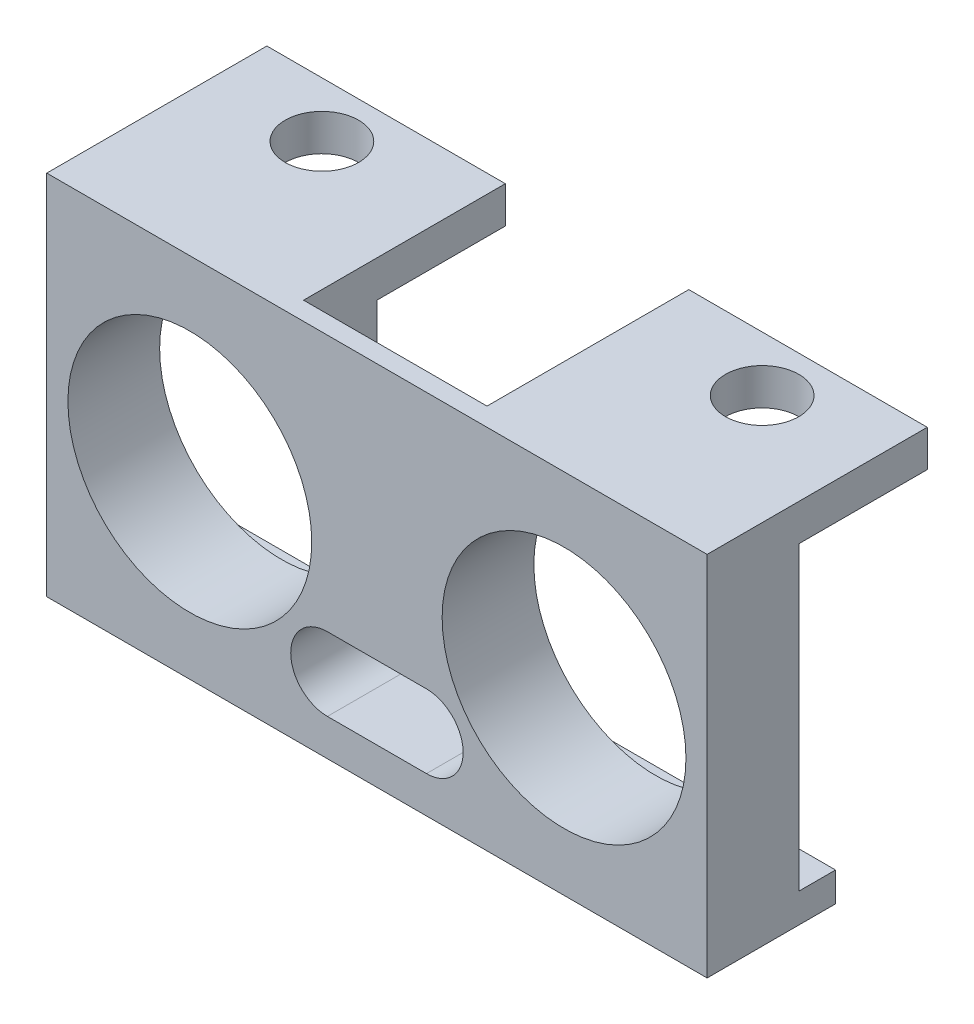
ISO-10303-21;
HEADER;
FILE_DESCRIPTION(('STEP AP214'),'2;1');
FILE_NAME('part.step','',(''),(''),'','','');
FILE_SCHEMA(('AUTOMOTIVE_DESIGN { 1 0 10303 214 1 1 1 1 }'));
ENDSEC;
DATA;
#1=APPLICATION_CONTEXT('core data for automotive mechanical design processes');
#2=APPLICATION_PROTOCOL_DEFINITION('international standard','automotive_design',2000,#1);
#3=PRODUCT_CONTEXT('',#1,'mechanical');
#4=PRODUCT('Part','Part','',(#3));
#5=PRODUCT_RELATED_PRODUCT_CATEGORY('part','',(#4));
#6=PRODUCT_DEFINITION_FORMATION('','',#4);
#7=PRODUCT_DEFINITION_CONTEXT('part definition',#1,'design');
#8=PRODUCT_DEFINITION('design','',#6,#7);
#9=PRODUCT_DEFINITION_SHAPE('','',#8);
#10=(LENGTH_UNIT() NAMED_UNIT(*) SI_UNIT(.MILLI.,.METRE.));
#11=(NAMED_UNIT(*) PLANE_ANGLE_UNIT() SI_UNIT($,.RADIAN.));
#12=(NAMED_UNIT(*) SI_UNIT($,.STERADIAN.) SOLID_ANGLE_UNIT());
#13=UNCERTAINTY_MEASURE_WITH_UNIT(LENGTH_MEASURE(1.E-05),#10,'distance_accuracy_value','');
#14=(GEOMETRIC_REPRESENTATION_CONTEXT(3) GLOBAL_UNCERTAINTY_ASSIGNED_CONTEXT((#13)) GLOBAL_UNIT_ASSIGNED_CONTEXT((#10,
#11,#12)) REPRESENTATION_CONTEXT('',''));
#15=CARTESIAN_POINT('',(0.,0.,0.));
#16=DIRECTION('',(0.,0.,1.));
#17=DIRECTION('',(1.,0.,0.));
#18=AXIS2_PLACEMENT_3D('',#15,#16,#17);
#19=CARTESIAN_POINT('',(0.,0.,0.));
#20=DIRECTION('',(0.,0.,-1.));
#21=DIRECTION('',(-1.,0.,0.));
#22=AXIS2_PLACEMENT_3D('',#19,#20,#21);
#23=PLANE('',#22);
#24=CARTESIAN_POINT('',(9.906,12.446,0.));
#25=DIRECTION('',(0.,0.,1.));
#26=DIRECTION('',(1.,0.,0.));
#27=AXIS2_PLACEMENT_3D('',#24,#25,#26);
#28=CIRCLE('',#27,8.44);
#29=CARTESIAN_POINT('',(18.346,12.446,0.));
#30=VERTEX_POINT('',#29);
#31=EDGE_CURVE('E296',#30,#30,#28,.T.);
#32=ORIENTED_EDGE('',*,*,#31,.T.);
#33=EDGE_LOOP('',(#32));
#34=FACE_BOUND('',#33,.T.);
#35=CARTESIAN_POINT('',(35.814,12.446,0.));
#36=DIRECTION('',(0.,0.,1.));
#37=DIRECTION('',(1.,0.,0.));
#38=AXIS2_PLACEMENT_3D('',#35,#36,#37);
#39=CIRCLE('',#38,8.44);
#40=CARTESIAN_POINT('',(44.254,12.446,0.));
#41=VERTEX_POINT('',#40);
#42=EDGE_CURVE('E292',#41,#41,#39,.T.);
#43=ORIENTED_EDGE('',*,*,#42,.T.);
#44=EDGE_LOOP('',(#43));
#45=FACE_BOUND('',#44,.T.);
#46=DIRECTION('',(-1.,0.,0.));
#47=VECTOR('',#46,1.);
#48=CARTESIAN_POINT('',(19.431,7.62,0.));
#49=LINE('',#48,#47);
#50=CARTESIAN_POINT('',(26.289,7.62,0.));
#51=VERTEX_POINT('',#50);
#52=CARTESIAN_POINT('',(19.431,7.62,0.));
#53=VERTEX_POINT('',#52);
#54=EDGE_CURVE('E267',#51,#53,#49,.T.);
#55=ORIENTED_EDGE('',*,*,#54,.T.);
#56=CARTESIAN_POINT('',(19.431,5.08,0.));
#57=DIRECTION('',(0.,0.,1.));
#58=DIRECTION('',(1.,0.,0.));
#59=AXIS2_PLACEMENT_3D('',#56,#57,#58);
#60=CIRCLE('',#59,2.54);
#61=CARTESIAN_POINT('',(19.431,2.54,0.));
#62=VERTEX_POINT('',#61);
#63=EDGE_CURVE('E262',#53,#62,#60,.T.);
#64=ORIENTED_EDGE('',*,*,#63,.T.);
#65=DIRECTION('',(1.,0.,0.));
#66=VECTOR('',#65,1.);
#67=CARTESIAN_POINT('',(19.431,2.54,0.));
#68=LINE('',#67,#66);
#69=CARTESIAN_POINT('',(26.289,2.54,0.));
#70=VERTEX_POINT('',#69);
#71=EDGE_CURVE('E276',#62,#70,#68,.T.);
#72=ORIENTED_EDGE('',*,*,#71,.T.);
#73=CARTESIAN_POINT('',(26.289,5.08,0.));
#74=DIRECTION('',(0.,0.,1.));
#75=DIRECTION('',(1.,0.,0.));
#76=AXIS2_PLACEMENT_3D('',#73,#74,#75);
#77=CIRCLE('',#76,2.54);
#78=EDGE_CURVE('E279',#70,#51,#77,.T.);
#79=ORIENTED_EDGE('',*,*,#78,.T.);
#80=EDGE_LOOP('',(#55,#64,#72,#79));
#81=FACE_BOUND('',#80,.T.);
#82=DIRECTION('',(0.,1.,0.));
#83=VECTOR('',#82,1.);
#84=CARTESIAN_POINT('',(45.72,0.,0.));
#85=LINE('',#84,#83);
#86=CARTESIAN_POINT('',(45.72,2.032,0.));
#87=VERTEX_POINT('',#86);
#88=CARTESIAN_POINT('',(45.72,22.86,0.));
#89=VERTEX_POINT('',#88);
#90=EDGE_CURVE('E314',#87,#89,#85,.T.);
#91=ORIENTED_EDGE('',*,*,#90,.F.);
#92=DIRECTION('',(1.,0.,0.));
#93=VECTOR('',#92,1.);
#94=CARTESIAN_POINT('',(45.72,2.032,0.));
#95=LINE('',#94,#93);
#96=CARTESIAN_POINT('',(0.,2.032,0.));
#97=VERTEX_POINT('',#96);
#98=EDGE_CURVE('E181',#97,#87,#95,.T.);
#99=ORIENTED_EDGE('',*,*,#98,.F.);
#100=DIRECTION('',(0.,-1.,0.));
#101=VECTOR('',#100,1.);
#102=CARTESIAN_POINT('',(0.,0.,0.));
#103=LINE('',#102,#101);
#104=CARTESIAN_POINT('',(0.,22.86,0.));
#105=VERTEX_POINT('',#104);
#106=EDGE_CURVE('E302',#105,#97,#103,.T.);
#107=ORIENTED_EDGE('',*,*,#106,.F.);
#108=DIRECTION('',(-1.,0.,0.));
#109=VECTOR('',#108,1.);
#110=CARTESIAN_POINT('',(0.,22.86,0.));
#111=LINE('',#110,#109);
#112=CARTESIAN_POINT('',(16.51,22.86,0.));
#113=VERTEX_POINT('',#112);
#114=EDGE_CURVE('E316',#113,#105,#111,.T.);
#115=ORIENTED_EDGE('',*,*,#114,.F.);
#116=DIRECTION('',(0.,1.,0.));
#117=VECTOR('',#116,1.);
#118=CARTESIAN_POINT('',(16.51,22.86,0.));
#119=LINE('',#118,#117);
#120=CARTESIAN_POINT('',(16.51,19.05,0.));
#121=VERTEX_POINT('',#120);
#122=EDGE_CURVE('E248',#121,#113,#119,.T.);
#123=ORIENTED_EDGE('',*,*,#122,.F.);
#124=DIRECTION('',(-1.,0.,0.));
#125=VECTOR('',#124,1.);
#126=CARTESIAN_POINT('',(29.21,19.05,0.));
#127=LINE('',#126,#125);
#128=CARTESIAN_POINT('',(29.21,19.05,0.));
#129=VERTEX_POINT('',#128);
#130=EDGE_CURVE('E256',#129,#121,#127,.T.);
#131=ORIENTED_EDGE('',*,*,#130,.F.);
#132=DIRECTION('',(0.,-1.,0.));
#133=VECTOR('',#132,1.);
#134=CARTESIAN_POINT('',(29.21,22.86,0.));
#135=LINE('',#134,#133);
#136=CARTESIAN_POINT('',(29.21,22.86,0.));
#137=VERTEX_POINT('',#136);
#138=EDGE_CURVE('E236',#137,#129,#135,.T.);
#139=ORIENTED_EDGE('',*,*,#138,.F.);
#140=EDGE_CURVE('E309',#89,#137,#111,.T.);
#141=ORIENTED_EDGE('',*,*,#140,.F.);
#142=EDGE_LOOP('',(#91,#99,#107,#115,#123,#131,#139,#141));
#143=FACE_BOUND('',#142,.T.);
#144=ADVANCED_FACE('F39',(#34,#45,#81,#143),#23,.T.);
#145=CARTESIAN_POINT('',(0.,0.,6.35));
#146=DIRECTION('',(0.,0.,-1.));
#147=DIRECTION('',(-1.,0.,0.));
#148=AXIS2_PLACEMENT_3D('',#145,#146,#147);
#149=PLANE('',#148);
#150=CARTESIAN_POINT('',(35.814,12.446,6.35));
#151=DIRECTION('',(0.,0.,1.));
#152=DIRECTION('',(1.,0.,0.));
#153=AXIS2_PLACEMENT_3D('',#150,#151,#152);
#154=CIRCLE('',#153,8.44);
#155=CARTESIAN_POINT('',(44.254,12.446,6.35));
#156=VERTEX_POINT('',#155);
#157=EDGE_CURVE('E293',#156,#156,#154,.T.);
#158=ORIENTED_EDGE('',*,*,#157,.F.);
#159=EDGE_LOOP('',(#158));
#160=FACE_BOUND('',#159,.T.);
#161=CARTESIAN_POINT('',(9.906,12.446,6.35));
#162=DIRECTION('',(0.,0.,1.));
#163=DIRECTION('',(1.,0.,0.));
#164=AXIS2_PLACEMENT_3D('',#161,#162,#163);
#165=CIRCLE('',#164,8.44);
#166=CARTESIAN_POINT('',(18.346,12.446,6.35));
#167=VERTEX_POINT('',#166);
#168=EDGE_CURVE('E299',#167,#167,#165,.T.);
#169=ORIENTED_EDGE('',*,*,#168,.F.);
#170=EDGE_LOOP('',(#169));
#171=FACE_BOUND('',#170,.T.);
#172=DIRECTION('',(0.,-1.,0.));
#173=VECTOR('',#172,1.);
#174=CARTESIAN_POINT('',(0.,0.,6.35));
#175=LINE('',#174,#173);
#176=CARTESIAN_POINT('',(0.,25.4,6.35));
#177=VERTEX_POINT('',#176);
#178=CARTESIAN_POINT('',(0.,0.,6.35));
#179=VERTEX_POINT('',#178);
#180=EDGE_CURVE('E305',#177,#179,#175,.T.);
#181=ORIENTED_EDGE('',*,*,#180,.T.);
#182=DIRECTION('',(1.,0.,0.));
#183=VECTOR('',#182,1.);
#184=CARTESIAN_POINT('',(0.,0.,6.35));
#185=LINE('',#184,#183);
#186=CARTESIAN_POINT('',(45.72,0.,6.35));
#187=VERTEX_POINT('',#186);
#188=EDGE_CURVE('E308',#179,#187,#185,.T.);
#189=ORIENTED_EDGE('',*,*,#188,.T.);
#190=DIRECTION('',(0.,1.,0.));
#191=VECTOR('',#190,1.);
#192=CARTESIAN_POINT('',(45.72,0.,6.35));
#193=LINE('',#192,#191);
#194=CARTESIAN_POINT('',(45.72,25.4,6.35));
#195=VERTEX_POINT('',#194);
#196=EDGE_CURVE('E168',#187,#195,#193,.T.);
#197=ORIENTED_EDGE('',*,*,#196,.T.);
#198=DIRECTION('',(-1.,0.,0.));
#199=VECTOR('',#198,1.);
#200=CARTESIAN_POINT('',(45.72,25.4,6.35));
#201=LINE('',#200,#199);
#202=EDGE_CURVE('E216',#195,#177,#201,.T.);
#203=ORIENTED_EDGE('',*,*,#202,.T.);
#204=EDGE_LOOP('',(#181,#189,#197,#203));
#205=FACE_BOUND('',#204,.T.);
#206=CARTESIAN_POINT('',(19.431,5.08,6.35));
#207=DIRECTION('',(0.,0.,1.));
#208=DIRECTION('',(1.,0.,0.));
#209=AXIS2_PLACEMENT_3D('',#206,#207,#208);
#210=CIRCLE('',#209,2.54);
#211=CARTESIAN_POINT('',(19.431,7.62,6.35));
#212=VERTEX_POINT('',#211);
#213=CARTESIAN_POINT('',(19.431,2.54,6.35));
#214=VERTEX_POINT('',#213);
#215=EDGE_CURVE('E264',#212,#214,#210,.T.);
#216=ORIENTED_EDGE('',*,*,#215,.F.);
#217=DIRECTION('',(-1.,0.,0.));
#218=VECTOR('',#217,1.);
#219=CARTESIAN_POINT('',(19.431,7.62,6.35));
#220=LINE('',#219,#218);
#221=CARTESIAN_POINT('',(26.289,7.62,6.35));
#222=VERTEX_POINT('',#221);
#223=EDGE_CURVE('E271',#222,#212,#220,.T.);
#224=ORIENTED_EDGE('',*,*,#223,.F.);
#225=CARTESIAN_POINT('',(26.289,5.08,6.35));
#226=DIRECTION('',(0.,0.,1.));
#227=DIRECTION('',(1.,0.,0.));
#228=AXIS2_PLACEMENT_3D('',#225,#226,#227);
#229=CIRCLE('',#228,2.54);
#230=CARTESIAN_POINT('',(26.289,2.54,6.35));
#231=VERTEX_POINT('',#230);
#232=EDGE_CURVE('E269',#231,#222,#229,.T.);
#233=ORIENTED_EDGE('',*,*,#232,.F.);
#234=DIRECTION('',(1.,0.,0.));
#235=VECTOR('',#234,1.);
#236=CARTESIAN_POINT('',(19.431,2.54,6.35));
#237=LINE('',#236,#235);
#238=EDGE_CURVE('E266',#214,#231,#237,.T.);
#239=ORIENTED_EDGE('',*,*,#238,.F.);
#240=EDGE_LOOP('',(#216,#224,#233,#239));
#241=FACE_BOUND('',#240,.T.);
#242=ADVANCED_FACE('F361',(#160,#171,#205,#241),#149,.F.);
#243=CARTESIAN_POINT('',(0.,0.,6.35));
#244=DIRECTION('',(1.,0.,0.));
#245=DIRECTION('',(0.,0.,-1.));
#246=AXIS2_PLACEMENT_3D('',#243,#244,#245);
#247=PLANE('',#246);
#248=ORIENTED_EDGE('',*,*,#106,.T.);
#249=DIRECTION('',(0.,0.,1.));
#250=VECTOR('',#249,1.);
#251=CARTESIAN_POINT('',(0.,2.032,-2.54));
#252=LINE('',#251,#250);
#253=CARTESIAN_POINT('',(0.,2.032,-2.54));
#254=VERTEX_POINT('',#253);
#255=EDGE_CURVE('E192',#254,#97,#252,.T.);
#256=ORIENTED_EDGE('',*,*,#255,.F.);
#257=DIRECTION('',(0.,1.,0.));
#258=VECTOR('',#257,1.);
#259=CARTESIAN_POINT('',(0.,0.,-2.54));
#260=LINE('',#259,#258);
#261=CARTESIAN_POINT('',(0.,0.,-2.54));
#262=VERTEX_POINT('',#261);
#263=EDGE_CURVE('E176',#262,#254,#260,.T.);
#264=ORIENTED_EDGE('',*,*,#263,.F.);
#265=DIRECTION('',(0.,0.,-1.));
#266=VECTOR('',#265,1.);
#267=CARTESIAN_POINT('',(0.,0.,6.35));
#268=LINE('',#267,#266);
#269=EDGE_CURVE('E11',#179,#262,#268,.T.);
#270=ORIENTED_EDGE('',*,*,#269,.F.);
#271=ORIENTED_EDGE('',*,*,#180,.F.);
#272=DIRECTION('',(0.,0.,-1.));
#273=VECTOR('',#272,1.);
#274=CARTESIAN_POINT('',(0.,25.4,6.35));
#275=LINE('',#274,#273);
#276=CARTESIAN_POINT('',(0.,25.4,-8.89));
#277=VERTEX_POINT('',#276);
#278=EDGE_CURVE('E195',#177,#277,#275,.T.);
#279=ORIENTED_EDGE('',*,*,#278,.T.);
#280=DIRECTION('',(0.,-1.,0.));
#281=VECTOR('',#280,1.);
#282=CARTESIAN_POINT('',(0.,25.4,-8.89));
#283=LINE('',#282,#281);
#284=CARTESIAN_POINT('',(0.,22.86,-8.89));
#285=VERTEX_POINT('',#284);
#286=EDGE_CURVE('E219',#277,#285,#283,.T.);
#287=ORIENTED_EDGE('',*,*,#286,.T.);
#288=DIRECTION('',(0.,0.,-1.));
#289=VECTOR('',#288,1.);
#290=CARTESIAN_POINT('',(0.,22.86,6.35));
#291=LINE('',#290,#289);
#292=EDGE_CURVE('E194',#105,#285,#291,.T.);
#293=ORIENTED_EDGE('',*,*,#292,.F.);
#294=EDGE_LOOP('',(#248,#256,#264,#270,#271,#279,#287,#293));
#295=FACE_BOUND('',#294,.T.);
#296=ADVANCED_FACE('F41',(#295),#247,.F.);
#297=CARTESIAN_POINT('',(0.,0.,6.35));
#298=DIRECTION('',(0.,1.,0.));
#299=DIRECTION('',(0.,0.,1.));
#300=AXIS2_PLACEMENT_3D('',#297,#298,#299);
#301=PLANE('',#300);
#302=ORIENTED_EDGE('',*,*,#269,.T.);
#303=DIRECTION('',(-1.,0.,0.));
#304=VECTOR('',#303,1.);
#305=CARTESIAN_POINT('',(45.72,0.,-2.54));
#306=LINE('',#305,#304);
#307=CARTESIAN_POINT('',(45.72,0.,-2.54));
#308=VERTEX_POINT('',#307);
#309=EDGE_CURVE('E171',#308,#262,#306,.T.);
#310=ORIENTED_EDGE('',*,*,#309,.F.);
#311=DIRECTION('',(0.,0.,-1.));
#312=VECTOR('',#311,1.);
#313=CARTESIAN_POINT('',(45.72,0.,6.35));
#314=LINE('',#313,#312);
#315=EDGE_CURVE('E47',#187,#308,#314,.T.);
#316=ORIENTED_EDGE('',*,*,#315,.F.);
#317=ORIENTED_EDGE('',*,*,#188,.F.);
#318=EDGE_LOOP('',(#302,#310,#316,#317));
#319=FACE_BOUND('',#318,.T.);
#320=ADVANCED_FACE('F172',(#319),#301,.F.);
#321=CARTESIAN_POINT('',(45.72,0.,6.35));
#322=DIRECTION('',(-1.,0.,0.));
#323=DIRECTION('',(0.,0.,1.));
#324=AXIS2_PLACEMENT_3D('',#321,#322,#323);
#325=PLANE('',#324);
#326=ORIENTED_EDGE('',*,*,#315,.T.);
#327=DIRECTION('',(0.,-1.,0.));
#328=VECTOR('',#327,1.);
#329=CARTESIAN_POINT('',(45.72,0.,-2.54));
#330=LINE('',#329,#328);
#331=CARTESIAN_POINT('',(45.72,2.032,-2.54));
#332=VERTEX_POINT('',#331);
#333=EDGE_CURVE('E166',#332,#308,#330,.T.);
#334=ORIENTED_EDGE('',*,*,#333,.F.);
#335=DIRECTION('',(0.,0.,1.));
#336=VECTOR('',#335,1.);
#337=CARTESIAN_POINT('',(45.72,2.032,-2.54));
#338=LINE('',#337,#336);
#339=EDGE_CURVE('E54',#332,#87,#338,.T.);
#340=ORIENTED_EDGE('',*,*,#339,.T.);
#341=ORIENTED_EDGE('',*,*,#90,.T.);
#342=DIRECTION('',(0.,0.,1.));
#343=VECTOR('',#342,1.);
#344=CARTESIAN_POINT('',(45.72,22.86,-8.89));
#345=LINE('',#344,#343);
#346=CARTESIAN_POINT('',(45.72,22.86,-8.89));
#347=VERTEX_POINT('',#346);
#348=EDGE_CURVE('E199',#347,#89,#345,.T.);
#349=ORIENTED_EDGE('',*,*,#348,.F.);
#350=DIRECTION('',(0.,-1.,0.));
#351=VECTOR('',#350,1.);
#352=CARTESIAN_POINT('',(45.72,25.4,-8.89));
#353=LINE('',#352,#351);
#354=CARTESIAN_POINT('',(45.72,25.4,-8.89));
#355=VERTEX_POINT('',#354);
#356=EDGE_CURVE('E234',#355,#347,#353,.T.);
#357=ORIENTED_EDGE('',*,*,#356,.F.);
#358=DIRECTION('',(0.,0.,1.));
#359=VECTOR('',#358,1.);
#360=CARTESIAN_POINT('',(45.72,25.4,-8.89));
#361=LINE('',#360,#359);
#362=EDGE_CURVE('E214',#355,#195,#361,.T.);
#363=ORIENTED_EDGE('',*,*,#362,.T.);
#364=ORIENTED_EDGE('',*,*,#196,.F.);
#365=EDGE_LOOP('',(#326,#334,#340,#341,#349,#357,#363,#364));
#366=FACE_BOUND('',#365,.T.);
#367=ADVANCED_FACE('F164',(#366),#325,.F.);
#368=CARTESIAN_POINT('',(9.906,12.446,6.35));
#369=DIRECTION('',(0.,0.,-1.));
#370=DIRECTION('',(-1.,0.,0.));
#371=AXIS2_PLACEMENT_3D('',#368,#369,#370);
#372=CYLINDRICAL_SURFACE('',#371,8.44);
#373=ORIENTED_EDGE('',*,*,#168,.T.);
#374=EDGE_LOOP('',(#373));
#375=FACE_BOUND('',#374,.T.);
#376=ORIENTED_EDGE('',*,*,#31,.F.);
#377=EDGE_LOOP('',(#376));
#378=FACE_BOUND('',#377,.T.);
#379=ADVANCED_FACE('F394',(#375,#378),#372,.F.);
#380=CARTESIAN_POINT('',(35.814,12.446,6.35));
#381=DIRECTION('',(0.,0.,-1.));
#382=DIRECTION('',(-1.,0.,0.));
#383=AXIS2_PLACEMENT_3D('',#380,#381,#382);
#384=CYLINDRICAL_SURFACE('',#383,8.44);
#385=ORIENTED_EDGE('',*,*,#157,.T.);
#386=EDGE_LOOP('',(#385));
#387=FACE_BOUND('',#386,.T.);
#388=ORIENTED_EDGE('',*,*,#42,.F.);
#389=EDGE_LOOP('',(#388));
#390=FACE_BOUND('',#389,.T.);
#391=ADVANCED_FACE('F551',(#387,#390),#384,.F.);
#392=CARTESIAN_POINT('',(19.431,5.08,6.35));
#393=DIRECTION('',(0.,0.,-1.));
#394=DIRECTION('',(-1.,0.,0.));
#395=AXIS2_PLACEMENT_3D('',#392,#393,#394);
#396=CYLINDRICAL_SURFACE('',#395,2.54);
#397=ORIENTED_EDGE('',*,*,#63,.F.);
#398=DIRECTION('',(0.,0.,-1.));
#399=VECTOR('',#398,1.);
#400=CARTESIAN_POINT('',(19.431,7.62,6.35));
#401=LINE('',#400,#399);
#402=EDGE_CURVE('E273',#212,#53,#401,.T.);
#403=ORIENTED_EDGE('',*,*,#402,.F.);
#404=ORIENTED_EDGE('',*,*,#215,.T.);
#405=DIRECTION('',(0.,0.,-1.));
#406=VECTOR('',#405,1.);
#407=CARTESIAN_POINT('',(19.431,2.54,6.35));
#408=LINE('',#407,#406);
#409=EDGE_CURVE('E289',#214,#62,#408,.T.);
#410=ORIENTED_EDGE('',*,*,#409,.T.);
#411=EDGE_LOOP('',(#397,#403,#404,#410));
#412=FACE_BOUND('',#411,.T.);
#413=ADVANCED_FACE('F542',(#412),#396,.F.);
#414=CARTESIAN_POINT('',(19.431,2.54,6.35));
#415=DIRECTION('',(0.,1.,0.));
#416=DIRECTION('',(-1.,0.,0.));
#417=AXIS2_PLACEMENT_3D('',#414,#415,#416);
#418=PLANE('',#417);
#419=ORIENTED_EDGE('',*,*,#71,.F.);
#420=ORIENTED_EDGE('',*,*,#409,.F.);
#421=ORIENTED_EDGE('',*,*,#238,.T.);
#422=DIRECTION('',(0.,0.,-1.));
#423=VECTOR('',#422,1.);
#424=CARTESIAN_POINT('',(26.289,2.54,6.35));
#425=LINE('',#424,#423);
#426=EDGE_CURVE('E287',#231,#70,#425,.T.);
#427=ORIENTED_EDGE('',*,*,#426,.T.);
#428=EDGE_LOOP('',(#419,#420,#421,#427));
#429=FACE_BOUND('',#428,.T.);
#430=ADVANCED_FACE('F533',(#429),#418,.T.);
#431=CARTESIAN_POINT('',(26.289,5.08,6.35));
#432=DIRECTION('',(0.,0.,-1.));
#433=DIRECTION('',(-1.,0.,0.));
#434=AXIS2_PLACEMENT_3D('',#431,#432,#433);
#435=CYLINDRICAL_SURFACE('',#434,2.54);
#436=ORIENTED_EDGE('',*,*,#78,.F.);
#437=ORIENTED_EDGE('',*,*,#426,.F.);
#438=ORIENTED_EDGE('',*,*,#232,.T.);
#439=DIRECTION('',(0.,0.,-1.));
#440=VECTOR('',#439,1.);
#441=CARTESIAN_POINT('',(26.289,7.62,6.35));
#442=LINE('',#441,#440);
#443=EDGE_CURVE('E62',#222,#51,#442,.T.);
#444=ORIENTED_EDGE('',*,*,#443,.T.);
#445=EDGE_LOOP('',(#436,#437,#438,#444));
#446=FACE_BOUND('',#445,.T.);
#447=ADVANCED_FACE('F525',(#446),#435,.F.);
#448=CARTESIAN_POINT('',(19.431,7.62,6.35));
#449=DIRECTION('',(0.,-1.,0.));
#450=DIRECTION('',(1.,0.,0.));
#451=AXIS2_PLACEMENT_3D('',#448,#449,#450);
#452=PLANE('',#451);
#453=ORIENTED_EDGE('',*,*,#54,.F.);
#454=ORIENTED_EDGE('',*,*,#443,.F.);
#455=ORIENTED_EDGE('',*,*,#223,.T.);
#456=ORIENTED_EDGE('',*,*,#402,.T.);
#457=EDGE_LOOP('',(#453,#454,#455,#456));
#458=FACE_BOUND('',#457,.T.);
#459=ADVANCED_FACE('F507',(#458),#452,.T.);
#460=CARTESIAN_POINT('',(29.21,22.86,5.08));
#461=DIRECTION('',(1.,0.,0.));
#462=DIRECTION('',(0.,1.,0.));
#463=AXIS2_PLACEMENT_3D('',#460,#461,#462);
#464=PLANE('',#463);
#465=ORIENTED_EDGE('',*,*,#138,.T.);
#466=DIRECTION('',(0.,0.,-1.));
#467=VECTOR('',#466,1.);
#468=CARTESIAN_POINT('',(29.21,19.05,5.08));
#469=LINE('',#468,#467);
#470=CARTESIAN_POINT('',(29.21,19.05,5.08));
#471=VERTEX_POINT('',#470);
#472=EDGE_CURVE('E253',#471,#129,#469,.T.);
#473=ORIENTED_EDGE('',*,*,#472,.F.);
#474=DIRECTION('',(0.,-1.,0.));
#475=VECTOR('',#474,1.);
#476=CARTESIAN_POINT('',(29.21,22.86,5.08));
#477=LINE('',#476,#475);
#478=CARTESIAN_POINT('',(29.21,25.4,5.08));
#479=VERTEX_POINT('',#478);
#480=EDGE_CURVE('E244',#479,#471,#477,.T.);
#481=ORIENTED_EDGE('',*,*,#480,.F.);
#482=DIRECTION('',(0.,0.,-1.));
#483=VECTOR('',#482,1.);
#484=CARTESIAN_POINT('',(29.21,25.4,5.08));
#485=LINE('',#484,#483);
#486=CARTESIAN_POINT('',(29.21,25.4,-8.89));
#487=VERTEX_POINT('',#486);
#488=EDGE_CURVE('E208',#479,#487,#485,.T.);
#489=ORIENTED_EDGE('',*,*,#488,.T.);
#490=DIRECTION('',(0.,-1.,0.));
#491=VECTOR('',#490,1.);
#492=CARTESIAN_POINT('',(29.21,25.4,-8.89));
#493=LINE('',#492,#491);
#494=CARTESIAN_POINT('',(29.21,22.86,-8.89));
#495=VERTEX_POINT('',#494);
#496=EDGE_CURVE('E237',#487,#495,#493,.T.);
#497=ORIENTED_EDGE('',*,*,#496,.T.);
#498=DIRECTION('',(0.,0.,-1.));
#499=VECTOR('',#498,1.);
#500=CARTESIAN_POINT('',(29.21,22.86,5.08));
#501=LINE('',#500,#499);
#502=EDGE_CURVE('E227',#137,#495,#501,.T.);
#503=ORIENTED_EDGE('',*,*,#502,.F.);
#504=EDGE_LOOP('',(#465,#473,#481,#489,#497,#503));
#505=FACE_BOUND('',#504,.T.);
#506=ADVANCED_FACE('F346',(#505),#464,.F.);
#507=CARTESIAN_POINT('',(16.51,22.86,5.08));
#508=DIRECTION('',(-1.,0.,0.));
#509=DIRECTION('',(0.,0.,1.));
#510=AXIS2_PLACEMENT_3D('',#507,#508,#509);
#511=PLANE('',#510);
#512=ORIENTED_EDGE('',*,*,#122,.T.);
#513=DIRECTION('',(0.,0.,1.));
#514=VECTOR('',#513,1.);
#515=CARTESIAN_POINT('',(16.51,22.86,-8.89));
#516=LINE('',#515,#514);
#517=CARTESIAN_POINT('',(16.51,22.86,-8.89));
#518=VERTEX_POINT('',#517);
#519=EDGE_CURVE('E224',#518,#113,#516,.T.);
#520=ORIENTED_EDGE('',*,*,#519,.F.);
#521=DIRECTION('',(0.,-1.,0.));
#522=VECTOR('',#521,1.);
#523=CARTESIAN_POINT('',(16.51,25.4,-8.89));
#524=LINE('',#523,#522);
#525=CARTESIAN_POINT('',(16.51,25.4,-8.89));
#526=VERTEX_POINT('',#525);
#527=EDGE_CURVE('E240',#526,#518,#524,.T.);
#528=ORIENTED_EDGE('',*,*,#527,.F.);
#529=DIRECTION('',(0.,0.,1.));
#530=VECTOR('',#529,1.);
#531=CARTESIAN_POINT('',(16.51,25.4,-8.89));
#532=LINE('',#531,#530);
#533=CARTESIAN_POINT('',(16.51,25.4,5.08));
#534=VERTEX_POINT('',#533);
#535=EDGE_CURVE('E202',#526,#534,#532,.T.);
#536=ORIENTED_EDGE('',*,*,#535,.T.);
#537=DIRECTION('',(0.,1.,0.));
#538=VECTOR('',#537,1.);
#539=CARTESIAN_POINT('',(16.51,22.86,5.08));
#540=LINE('',#539,#538);
#541=CARTESIAN_POINT('',(16.51,19.05,5.08));
#542=VERTEX_POINT('',#541);
#543=EDGE_CURVE('E251',#542,#534,#540,.T.);
#544=ORIENTED_EDGE('',*,*,#543,.F.);
#545=DIRECTION('',(0.,0.,-1.));
#546=VECTOR('',#545,1.);
#547=CARTESIAN_POINT('',(16.51,19.05,5.08));
#548=LINE('',#547,#546);
#549=EDGE_CURVE('E260',#542,#121,#548,.T.);
#550=ORIENTED_EDGE('',*,*,#549,.T.);
#551=EDGE_LOOP('',(#512,#520,#528,#536,#544,#550));
#552=FACE_BOUND('',#551,.T.);
#553=ADVANCED_FACE('F338',(#552),#511,.F.);
#554=CARTESIAN_POINT('',(29.21,19.05,5.08));
#555=DIRECTION('',(0.,-1.,0.));
#556=DIRECTION('',(0.,0.,-1.));
#557=AXIS2_PLACEMENT_3D('',#554,#555,#556);
#558=PLANE('',#557);
#559=ORIENTED_EDGE('',*,*,#130,.T.);
#560=ORIENTED_EDGE('',*,*,#549,.F.);
#561=DIRECTION('',(-1.,0.,0.));
#562=VECTOR('',#561,1.);
#563=CARTESIAN_POINT('',(29.21,19.05,5.08));
#564=LINE('',#563,#562);
#565=EDGE_CURVE('E247',#471,#542,#564,.T.);
#566=ORIENTED_EDGE('',*,*,#565,.F.);
#567=ORIENTED_EDGE('',*,*,#472,.T.);
#568=EDGE_LOOP('',(#559,#560,#566,#567));
#569=FACE_BOUND('',#568,.T.);
#570=ADVANCED_FACE('F343',(#569),#558,.F.);
#571=CARTESIAN_POINT('',(0.,0.,5.08));
#572=DIRECTION('',(0.,0.,-1.));
#573=DIRECTION('',(-1.,0.,0.));
#574=AXIS2_PLACEMENT_3D('',#571,#572,#573);
#575=PLANE('',#574);
#576=ORIENTED_EDGE('',*,*,#480,.T.);
#577=ORIENTED_EDGE('',*,*,#565,.T.);
#578=ORIENTED_EDGE('',*,*,#543,.T.);
#579=DIRECTION('',(1.,0.,0.));
#580=VECTOR('',#579,1.);
#581=CARTESIAN_POINT('',(16.51,25.4,5.08));
#582=LINE('',#581,#580);
#583=EDGE_CURVE('E205',#534,#479,#582,.T.);
#584=ORIENTED_EDGE('',*,*,#583,.T.);
#585=EDGE_LOOP('',(#576,#577,#578,#584));
#586=FACE_BOUND('',#585,.T.);
#587=ADVANCED_FACE('F366',(#586),#575,.T.);
#588=CARTESIAN_POINT('',(0.,22.86,0.));
#589=DIRECTION('',(0.,-1.,0.));
#590=DIRECTION('',(0.,0.,-1.));
#591=AXIS2_PLACEMENT_3D('',#588,#589,#590);
#592=PLANE('',#591);
#593=CARTESIAN_POINT('',(38.1,22.86,-5.08));
#594=DIRECTION('',(0.,-1.,0.));
#595=DIRECTION('',(0.,0.,-1.));
#596=AXIS2_PLACEMENT_3D('',#593,#594,#595);
#597=CIRCLE('',#596,2.54);
#598=CARTESIAN_POINT('',(38.1,22.86,-7.62));
#599=VERTEX_POINT('',#598);
#600=EDGE_CURVE('E626',#599,#599,#597,.T.);
#601=ORIENTED_EDGE('',*,*,#600,.F.);
#602=EDGE_LOOP('',(#601));
#603=FACE_BOUND('',#602,.T.);
#604=ORIENTED_EDGE('',*,*,#348,.T.);
#605=ORIENTED_EDGE('',*,*,#140,.T.);
#606=ORIENTED_EDGE('',*,*,#502,.T.);
#607=DIRECTION('',(1.,0.,0.));
#608=VECTOR('',#607,1.);
#609=CARTESIAN_POINT('',(29.21,22.86,-8.89));
#610=LINE('',#609,#608);
#611=EDGE_CURVE('E229',#495,#347,#610,.T.);
#612=ORIENTED_EDGE('',*,*,#611,.T.);
#613=EDGE_LOOP('',(#604,#605,#606,#612));
#614=FACE_BOUND('',#613,.T.);
#615=ADVANCED_FACE('F348',(#603,#614),#592,.T.);
#616=CARTESIAN_POINT('',(29.21,25.4,-8.89));
#617=DIRECTION('',(0.,0.,-1.));
#618=DIRECTION('',(-1.,0.,0.));
#619=AXIS2_PLACEMENT_3D('',#616,#617,#618);
#620=PLANE('',#619);
#621=ORIENTED_EDGE('',*,*,#611,.F.);
#622=ORIENTED_EDGE('',*,*,#496,.F.);
#623=DIRECTION('',(1.,0.,0.));
#624=VECTOR('',#623,1.);
#625=CARTESIAN_POINT('',(29.21,25.4,-8.89));
#626=LINE('',#625,#624);
#627=EDGE_CURVE('E211',#487,#355,#626,.T.);
#628=ORIENTED_EDGE('',*,*,#627,.T.);
#629=ORIENTED_EDGE('',*,*,#356,.T.);
#630=EDGE_LOOP('',(#621,#622,#628,#629));
#631=FACE_BOUND('',#630,.T.);
#632=ADVANCED_FACE('F351',(#631),#620,.T.);
#633=CARTESIAN_POINT('',(0.,25.4,-8.89));
#634=DIRECTION('',(0.,0.,-1.));
#635=DIRECTION('',(-1.,0.,0.));
#636=AXIS2_PLACEMENT_3D('',#633,#634,#635);
#637=PLANE('',#636);
#638=DIRECTION('',(1.,0.,0.));
#639=VECTOR('',#638,1.);
#640=CARTESIAN_POINT('',(0.,22.86,-8.89));
#641=LINE('',#640,#639);
#642=EDGE_CURVE('E221',#285,#518,#641,.T.);
#643=ORIENTED_EDGE('',*,*,#642,.F.);
#644=ORIENTED_EDGE('',*,*,#286,.F.);
#645=DIRECTION('',(1.,0.,0.));
#646=VECTOR('',#645,1.);
#647=CARTESIAN_POINT('',(0.,25.4,-8.89));
#648=LINE('',#647,#646);
#649=EDGE_CURVE('E198',#277,#526,#648,.T.);
#650=ORIENTED_EDGE('',*,*,#649,.T.);
#651=ORIENTED_EDGE('',*,*,#527,.T.);
#652=EDGE_LOOP('',(#643,#644,#650,#651));
#653=FACE_BOUND('',#652,.T.);
#654=ADVANCED_FACE('F335',(#653),#637,.T.);
#655=CARTESIAN_POINT('',(0.,25.4,0.));
#656=DIRECTION('',(0.,-1.,0.));
#657=DIRECTION('',(0.,0.,-1.));
#658=AXIS2_PLACEMENT_3D('',#655,#656,#657);
#659=PLANE('',#658);
#660=CARTESIAN_POINT('',(38.1,25.4,-5.08));
#661=DIRECTION('',(0.,-1.,0.));
#662=DIRECTION('',(0.,0.,-1.));
#663=AXIS2_PLACEMENT_3D('',#660,#661,#662);
#664=CIRCLE('',#663,2.54);
#665=CARTESIAN_POINT('',(38.1,25.4,-7.62));
#666=VERTEX_POINT('',#665);
#667=EDGE_CURVE('E183',#666,#666,#664,.T.);
#668=ORIENTED_EDGE('',*,*,#667,.T.);
#669=EDGE_LOOP('',(#668));
#670=FACE_BOUND('',#669,.T.);
#671=CARTESIAN_POINT('',(7.62,25.4,-5.07999999999999));
#672=DIRECTION('',(0.,-1.,0.));
#673=DIRECTION('',(0.,0.,1.));
#674=AXIS2_PLACEMENT_3D('',#671,#672,#673);
#675=CIRCLE('',#674,2.54);
#676=CARTESIAN_POINT('',(7.62,25.4,-2.53999999999999));
#677=VERTEX_POINT('',#676);
#678=EDGE_CURVE('E186',#677,#677,#675,.T.);
#679=ORIENTED_EDGE('',*,*,#678,.T.);
#680=EDGE_LOOP('',(#679));
#681=FACE_BOUND('',#680,.T.);
#682=ORIENTED_EDGE('',*,*,#278,.F.);
#683=ORIENTED_EDGE('',*,*,#202,.F.);
#684=ORIENTED_EDGE('',*,*,#362,.F.);
#685=ORIENTED_EDGE('',*,*,#627,.F.);
#686=ORIENTED_EDGE('',*,*,#488,.F.);
#687=ORIENTED_EDGE('',*,*,#583,.F.);
#688=ORIENTED_EDGE('',*,*,#535,.F.);
#689=ORIENTED_EDGE('',*,*,#649,.F.);
#690=EDGE_LOOP('',(#682,#683,#684,#685,#686,#687,#688,#689));
#691=FACE_BOUND('',#690,.T.);
#692=ADVANCED_FACE('F360',(#670,#681,#691),#659,.F.);
#693=CARTESIAN_POINT('',(7.62,22.86,-5.07999999999999));
#694=DIRECTION('',(0.,-1.,0.));
#695=DIRECTION('',(0.,0.,1.));
#696=AXIS2_PLACEMENT_3D('',#693,#694,#695);
#697=CIRCLE('',#696,2.54);
#698=CARTESIAN_POINT('',(7.62,22.86,-2.53999999999999));
#699=VERTEX_POINT('',#698);
#700=EDGE_CURVE('E624',#699,#699,#697,.T.);
#701=ORIENTED_EDGE('',*,*,#700,.F.);
#702=EDGE_LOOP('',(#701));
#703=FACE_BOUND('',#702,.T.);
#704=ORIENTED_EDGE('',*,*,#519,.T.);
#705=ORIENTED_EDGE('',*,*,#114,.T.);
#706=ORIENTED_EDGE('',*,*,#292,.T.);
#707=ORIENTED_EDGE('',*,*,#642,.T.);
#708=EDGE_LOOP('',(#704,#705,#706,#707));
#709=FACE_BOUND('',#708,.T.);
#710=ADVANCED_FACE('F325',(#703,#709),#592,.T.);
#711=CARTESIAN_POINT('',(45.72,2.032,-2.54));
#712=DIRECTION('',(0.,-1.,0.));
#713=DIRECTION('',(0.,0.,-1.));
#714=AXIS2_PLACEMENT_3D('',#711,#712,#713);
#715=PLANE('',#714);
#716=ORIENTED_EDGE('',*,*,#98,.T.);
#717=ORIENTED_EDGE('',*,*,#339,.F.);
#718=DIRECTION('',(1.,0.,0.));
#719=VECTOR('',#718,1.);
#720=CARTESIAN_POINT('',(45.72,2.032,-2.54));
#721=LINE('',#720,#719);
#722=EDGE_CURVE('E180',#254,#332,#721,.T.);
#723=ORIENTED_EDGE('',*,*,#722,.F.);
#724=ORIENTED_EDGE('',*,*,#255,.T.);
#725=EDGE_LOOP('',(#716,#717,#723,#724));
#726=FACE_BOUND('',#725,.T.);
#727=ADVANCED_FACE('F356',(#726),#715,.F.);
#728=CARTESIAN_POINT('',(0.,0.,-2.54));
#729=DIRECTION('',(0.,0.,1.));
#730=DIRECTION('',(1.,0.,0.));
#731=AXIS2_PLACEMENT_3D('',#728,#729,#730);
#732=PLANE('',#731);
#733=ORIENTED_EDGE('',*,*,#333,.T.);
#734=ORIENTED_EDGE('',*,*,#309,.T.);
#735=ORIENTED_EDGE('',*,*,#263,.T.);
#736=ORIENTED_EDGE('',*,*,#722,.T.);
#737=EDGE_LOOP('',(#733,#734,#735,#736));
#738=FACE_BOUND('',#737,.T.);
#739=ADVANCED_FACE('F178',(#738),#732,.F.);
#740=CARTESIAN_POINT('',(7.62,25.4,-5.07999999999999));
#741=DIRECTION('',(0.,-1.,0.));
#742=DIRECTION('',(0.,0.,-1.));
#743=AXIS2_PLACEMENT_3D('',#740,#741,#742);
#744=CYLINDRICAL_SURFACE('',#743,2.54);
#745=ORIENTED_EDGE('',*,*,#678,.F.);
#746=EDGE_LOOP('',(#745));
#747=FACE_BOUND('',#746,.T.);
#748=ORIENTED_EDGE('',*,*,#700,.T.);
#749=EDGE_LOOP('',(#748));
#750=FACE_BOUND('',#749,.T.);
#751=ADVANCED_FACE('F440',(#747,#750),#744,.F.);
#752=CARTESIAN_POINT('',(38.1,25.4,-5.08));
#753=DIRECTION('',(0.,-1.,0.));
#754=DIRECTION('',(0.,0.,-1.));
#755=AXIS2_PLACEMENT_3D('',#752,#753,#754);
#756=CYLINDRICAL_SURFACE('',#755,2.54);
#757=ORIENTED_EDGE('',*,*,#667,.F.);
#758=EDGE_LOOP('',(#757));
#759=FACE_BOUND('',#758,.T.);
#760=ORIENTED_EDGE('',*,*,#600,.T.);
#761=EDGE_LOOP('',(#760));
#762=FACE_BOUND('',#761,.T.);
#763=ADVANCED_FACE('F449',(#759,#762),#756,.F.);
#764=CLOSED_SHELL('',(#144,#242,#296,#320,#367,#379,#391,#413,#430,#447,#459,#506,#553,#570,
#587,#615,#632,#654,#692,#710,#727,#739,#751,#763));
#765=MANIFOLD_SOLID_BREP('B2',#764);
#766=ADVANCED_BREP_SHAPE_REPRESENTATION('',(#18,#765),#14);
#767=SHAPE_DEFINITION_REPRESENTATION(#9,#766);
ENDSEC;
END-ISO-10303-21;
